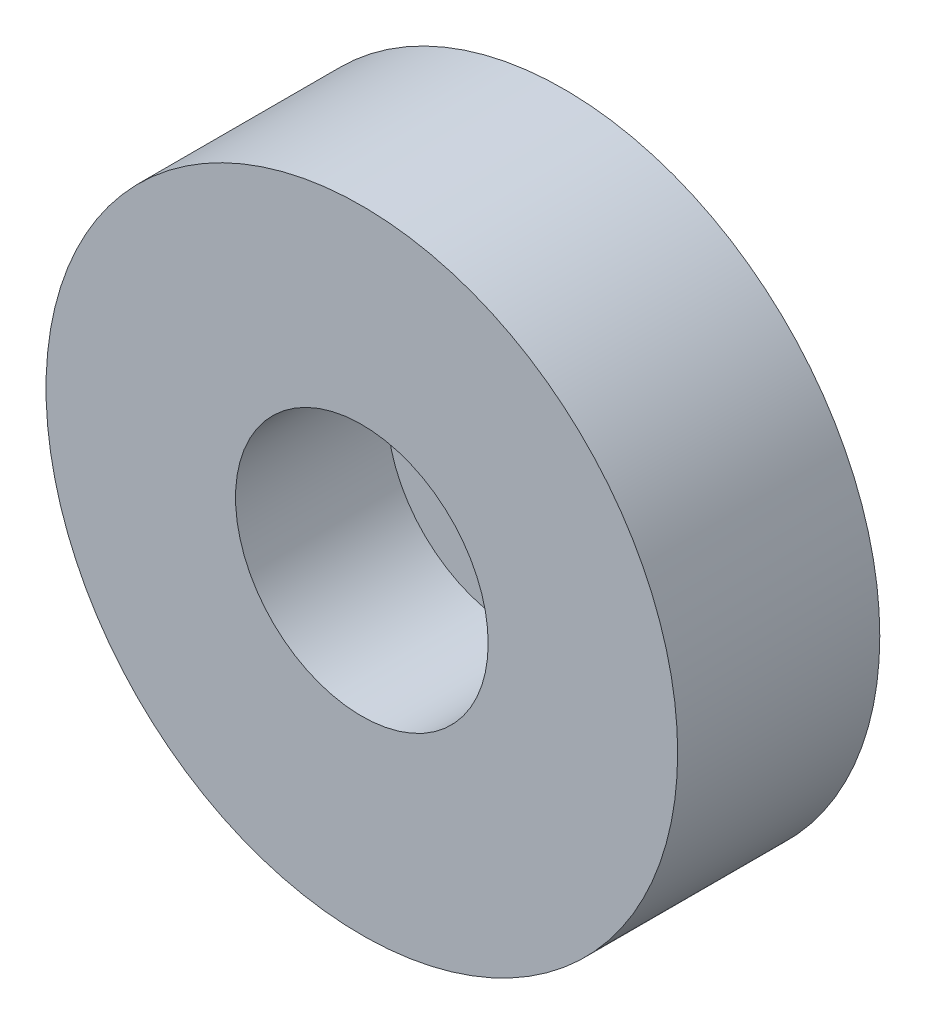
ISO-10303-21;
HEADER;
FILE_DESCRIPTION(('STEP AP214'),'2;1');
FILE_NAME('part.step','',(''),(''),'','','');
FILE_SCHEMA(('AUTOMOTIVE_DESIGN { 1 0 10303 214 1 1 1 1 }'));
ENDSEC;
DATA;
#1=APPLICATION_CONTEXT('core data for automotive mechanical design processes');
#2=APPLICATION_PROTOCOL_DEFINITION('international standard','automotive_design',2000,#1);
#3=PRODUCT_CONTEXT('',#1,'mechanical');
#4=PRODUCT('Part','Part','',(#3));
#5=PRODUCT_RELATED_PRODUCT_CATEGORY('part','',(#4));
#6=PRODUCT_DEFINITION_FORMATION('','',#4);
#7=PRODUCT_DEFINITION_CONTEXT('part definition',#1,'design');
#8=PRODUCT_DEFINITION('design','',#6,#7);
#9=PRODUCT_DEFINITION_SHAPE('','',#8);
#10=(LENGTH_UNIT() NAMED_UNIT(*) SI_UNIT(.MILLI.,.METRE.));
#11=(NAMED_UNIT(*) PLANE_ANGLE_UNIT() SI_UNIT($,.RADIAN.));
#12=(NAMED_UNIT(*) SI_UNIT($,.STERADIAN.) SOLID_ANGLE_UNIT());
#13=UNCERTAINTY_MEASURE_WITH_UNIT(LENGTH_MEASURE(1.E-05),#10,'distance_accuracy_value','');
#14=(GEOMETRIC_REPRESENTATION_CONTEXT(3) GLOBAL_UNCERTAINTY_ASSIGNED_CONTEXT((#13)) GLOBAL_UNIT_ASSIGNED_CONTEXT((#10,
#11,#12)) REPRESENTATION_CONTEXT('',''));
#15=CARTESIAN_POINT('',(0.,0.,0.));
#16=DIRECTION('',(0.,0.,1.));
#17=DIRECTION('',(1.,0.,0.));
#18=AXIS2_PLACEMENT_3D('',#15,#16,#17);
#19=CARTESIAN_POINT('',(0.,0.,4.));
#20=DIRECTION('',(0.,0.,-1.));
#21=DIRECTION('',(-1.,0.,0.));
#22=AXIS2_PLACEMENT_3D('',#19,#20,#21);
#23=CYLINDRICAL_SURFACE('',#22,12.5);
#24=CARTESIAN_POINT('',(0.,0.,4.));
#25=DIRECTION('',(0.,0.,1.));
#26=DIRECTION('',(1.,0.,0.));
#27=AXIS2_PLACEMENT_3D('',#24,#25,#26);
#28=CIRCLE('',#27,12.5);
#29=CARTESIAN_POINT('',(12.5,0.,4.));
#30=VERTEX_POINT('',#29);
#31=EDGE_CURVE('E11',#30,#30,#28,.T.);
#32=ORIENTED_EDGE('',*,*,#31,.F.);
#33=EDGE_LOOP('',(#32));
#34=FACE_BOUND('',#33,.T.);
#35=CARTESIAN_POINT('',(0.,0.,-4.));
#36=DIRECTION('',(0.,0.,1.));
#37=DIRECTION('',(1.,0.,0.));
#38=AXIS2_PLACEMENT_3D('',#35,#36,#37);
#39=CIRCLE('',#38,12.5);
#40=CARTESIAN_POINT('',(12.5,0.,-4.));
#41=VERTEX_POINT('',#40);
#42=EDGE_CURVE('E36',#41,#41,#39,.T.);
#43=ORIENTED_EDGE('',*,*,#42,.T.);
#44=EDGE_LOOP('',(#43));
#45=FACE_BOUND('',#44,.T.);
#46=ADVANCED_FACE('F33',(#34,#45),#23,.T.);
#47=CARTESIAN_POINT('',(0.,0.,4.));
#48=DIRECTION('',(0.,0.,1.));
#49=DIRECTION('',(1.,0.,0.));
#50=AXIS2_PLACEMENT_3D('',#47,#48,#49);
#51=PLANE('',#50);
#52=CARTESIAN_POINT('',(0.,0.,4.));
#53=DIRECTION('',(0.,0.,1.));
#54=DIRECTION('',(1.,0.,0.));
#55=AXIS2_PLACEMENT_3D('',#52,#53,#54);
#56=CIRCLE('',#55,5.);
#57=CARTESIAN_POINT('',(5.,0.,4.));
#58=VERTEX_POINT('',#57);
#59=EDGE_CURVE('E47',#58,#58,#56,.T.);
#60=ORIENTED_EDGE('',*,*,#59,.F.);
#61=EDGE_LOOP('',(#60));
#62=FACE_BOUND('',#61,.T.);
#63=ORIENTED_EDGE('',*,*,#31,.T.);
#64=EDGE_LOOP('',(#63));
#65=FACE_BOUND('',#64,.T.);
#66=ADVANCED_FACE('F72',(#62,#65),#51,.T.);
#67=CARTESIAN_POINT('',(0.,0.,-4.));
#68=DIRECTION('',(0.,0.,1.));
#69=DIRECTION('',(1.,0.,0.));
#70=AXIS2_PLACEMENT_3D('',#67,#68,#69);
#71=PLANE('',#70);
#72=CARTESIAN_POINT('',(0.,0.,-4.));
#73=DIRECTION('',(0.,0.,1.));
#74=DIRECTION('',(1.,0.,0.));
#75=AXIS2_PLACEMENT_3D('',#72,#73,#74);
#76=CIRCLE('',#75,2.25);
#77=CARTESIAN_POINT('',(2.25,0.,-4.));
#78=VERTEX_POINT('',#77);
#79=EDGE_CURVE('E50',#78,#78,#76,.F.);
#80=ORIENTED_EDGE('',*,*,#79,.F.);
#81=EDGE_LOOP('',(#80));
#82=FACE_BOUND('',#81,.T.);
#83=ORIENTED_EDGE('',*,*,#42,.F.);
#84=EDGE_LOOP('',(#83));
#85=FACE_BOUND('',#84,.T.);
#86=ADVANCED_FACE('F68',(#82,#85),#71,.F.);
#87=CARTESIAN_POINT('',(0.,0.,-18.1421356237309));
#88=DIRECTION('',(0.,0.,1.));
#89=DIRECTION('',(1.,0.,0.));
#90=AXIS2_PLACEMENT_3D('',#87,#88,#89);
#91=CYLINDRICAL_SURFACE('',#90,5.);
#92=CARTESIAN_POINT('',(0.,0.,-2.));
#93=DIRECTION('',(0.,0.,1.));
#94=DIRECTION('',(1.,0.,0.));
#95=AXIS2_PLACEMENT_3D('',#92,#93,#94);
#96=CIRCLE('',#95,5.);
#97=CARTESIAN_POINT('',(5.,0.,-2.));
#98=VERTEX_POINT('',#97);
#99=EDGE_CURVE('E43',#98,#98,#96,.F.);
#100=ORIENTED_EDGE('',*,*,#99,.T.);
#101=EDGE_LOOP('',(#100));
#102=FACE_BOUND('',#101,.T.);
#103=ORIENTED_EDGE('',*,*,#59,.T.);
#104=EDGE_LOOP('',(#103));
#105=FACE_BOUND('',#104,.T.);
#106=ADVANCED_FACE('F62',(#102,#105),#91,.F.);
#107=CARTESIAN_POINT('',(0.,0.,-2.));
#108=DIRECTION('',(0.,0.,1.));
#109=DIRECTION('',(1.,0.,0.));
#110=AXIS2_PLACEMENT_3D('',#107,#108,#109);
#111=PLANE('',#110);
#112=CARTESIAN_POINT('',(0.,0.,-2.));
#113=DIRECTION('',(0.,0.,1.));
#114=DIRECTION('',(1.,0.,0.));
#115=AXIS2_PLACEMENT_3D('',#112,#113,#114);
#116=CIRCLE('',#115,2.25);
#117=CARTESIAN_POINT('',(2.25,0.,-2.));
#118=VERTEX_POINT('',#117);
#119=EDGE_CURVE('E53',#118,#118,#116,.T.);
#120=ORIENTED_EDGE('',*,*,#119,.F.);
#121=EDGE_LOOP('',(#120));
#122=FACE_BOUND('',#121,.T.);
#123=ORIENTED_EDGE('',*,*,#99,.F.);
#124=EDGE_LOOP('',(#123));
#125=FACE_BOUND('',#124,.T.);
#126=ADVANCED_FACE('F59',(#122,#125),#111,.T.);
#127=CARTESIAN_POINT('',(0.,0.,-10.3639610306789));
#128=DIRECTION('',(0.,0.,1.));
#129=DIRECTION('',(1.,0.,0.));
#130=AXIS2_PLACEMENT_3D('',#127,#128,#129);
#131=CYLINDRICAL_SURFACE('',#130,2.25);
#132=ORIENTED_EDGE('',*,*,#79,.T.);
#133=EDGE_LOOP('',(#132));
#134=FACE_BOUND('',#133,.T.);
#135=ORIENTED_EDGE('',*,*,#119,.T.);
#136=EDGE_LOOP('',(#135));
#137=FACE_BOUND('',#136,.T.);
#138=ADVANCED_FACE('F57',(#134,#137),#131,.F.);
#139=CLOSED_SHELL('',(#46,#66,#86,#106,#126,#138));
#140=MANIFOLD_SOLID_BREP('B2',#139);
#141=ADVANCED_BREP_SHAPE_REPRESENTATION('',(#18,#140),#14);
#142=SHAPE_DEFINITION_REPRESENTATION(#9,#141);
ENDSEC;
END-ISO-10303-21;
